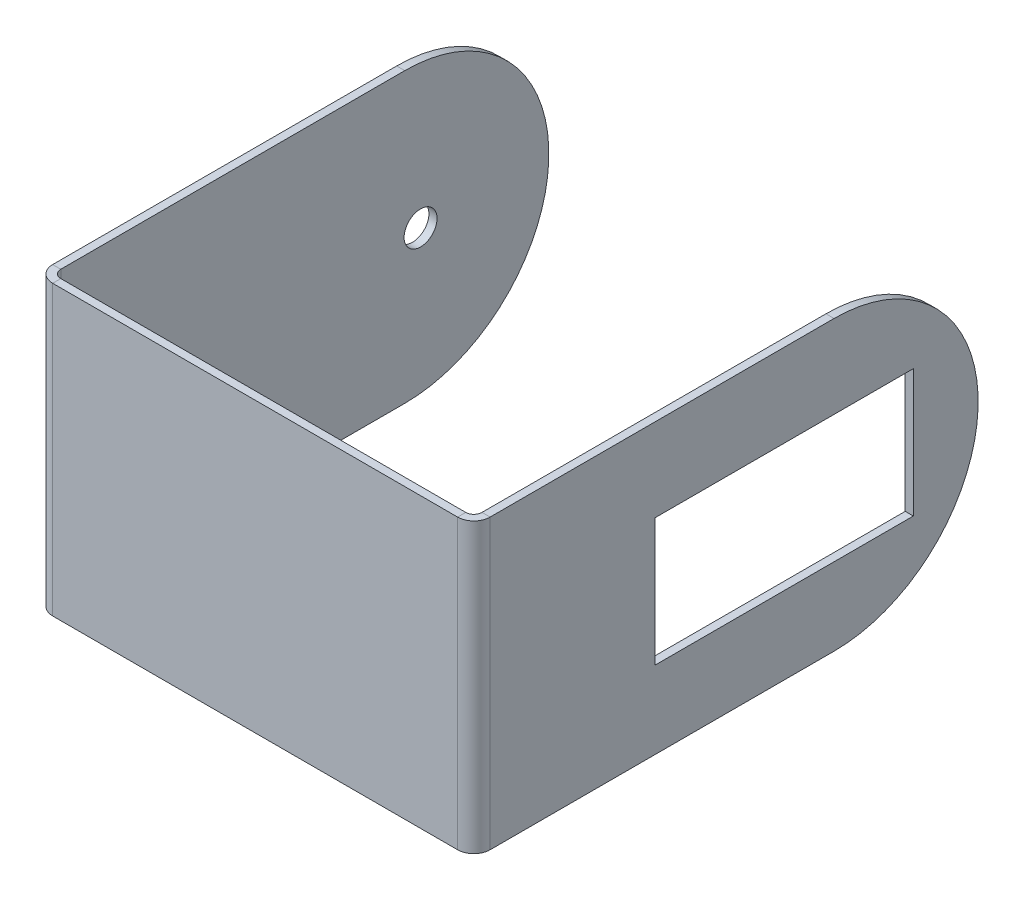
ISO-10303-21;
HEADER;
FILE_DESCRIPTION(('STEP AP214'),'2;1');
FILE_NAME('part.step','',(''),(''),'','','');
FILE_SCHEMA(('AUTOMOTIVE_DESIGN { 1 0 10303 214 1 1 1 1 }'));
ENDSEC;
DATA;
#1=APPLICATION_CONTEXT('core data for automotive mechanical design processes');
#2=APPLICATION_PROTOCOL_DEFINITION('international standard','automotive_design',2000,#1);
#3=PRODUCT_CONTEXT('',#1,'mechanical');
#4=PRODUCT('Part','Part','',(#3));
#5=PRODUCT_RELATED_PRODUCT_CATEGORY('part','',(#4));
#6=PRODUCT_DEFINITION_FORMATION('','',#4);
#7=PRODUCT_DEFINITION_CONTEXT('part definition',#1,'design');
#8=PRODUCT_DEFINITION('design','',#6,#7);
#9=PRODUCT_DEFINITION_SHAPE('','',#8);
#10=(LENGTH_UNIT() NAMED_UNIT(*) SI_UNIT(.MILLI.,.METRE.));
#11=(NAMED_UNIT(*) PLANE_ANGLE_UNIT() SI_UNIT($,.RADIAN.));
#12=(NAMED_UNIT(*) SI_UNIT($,.STERADIAN.) SOLID_ANGLE_UNIT());
#13=UNCERTAINTY_MEASURE_WITH_UNIT(LENGTH_MEASURE(1.E-05),#10,'distance_accuracy_value','');
#14=(GEOMETRIC_REPRESENTATION_CONTEXT(3) GLOBAL_UNCERTAINTY_ASSIGNED_CONTEXT((#13)) GLOBAL_UNIT_ASSIGNED_CONTEXT((#10,
#11,#12)) REPRESENTATION_CONTEXT('',''));
#15=CARTESIAN_POINT('',(0.,0.,0.));
#16=DIRECTION('',(0.,0.,1.));
#17=DIRECTION('',(1.,0.,0.));
#18=AXIS2_PLACEMENT_3D('',#15,#16,#17);
#19=CARTESIAN_POINT('',(62.7853260686794,40.884375444257,50.1276698219949));
#20=DIRECTION('',(0.,-1.,0.));
#21=DIRECTION('',(-1.,0.,0.));
#22=AXIS2_PLACEMENT_3D('',#19,#20,#21);
#23=PLANE('',#22);
#24=DIRECTION('',(0.,0.,1.));
#25=VECTOR('',#24,1.);
#26=CARTESIAN_POINT('',(60.1853259854794,40.884375444257,50.1276698219949));
#27=LINE('',#26,#25);
#28=CARTESIAN_POINT('',(60.1853259854794,40.884375444257,48.8276697803949));
#29=VERTEX_POINT('',#28);
#30=CARTESIAN_POINT('',(60.1853259854794,40.884375444257,50.1276698219949));
#31=VERTEX_POINT('',#30);
#32=EDGE_CURVE('E11',#29,#31,#27,.T.);
#33=ORIENTED_EDGE('',*,*,#32,.F.);
#34=DIRECTION('',(-1.,0.,0.));
#35=VECTOR('',#34,1.);
#36=CARTESIAN_POINT('',(62.7853260686794,40.884375444257,48.8276697803949));
#37=LINE('',#36,#35);
#38=CARTESIAN_POINT('',(-4.78217384812057,40.884375444257,48.8276697803949));
#39=VERTEX_POINT('',#38);
#40=EDGE_CURVE('E113',#29,#39,#37,.T.);
#41=ORIENTED_EDGE('',*,*,#40,.T.);
#42=DIRECTION('',(0.,0.,1.));
#43=VECTOR('',#42,1.);
#44=CARTESIAN_POINT('',(-4.78217384812057,40.884375444257,50.1276698219949));
#45=LINE('',#44,#43);
#46=CARTESIAN_POINT('',(-4.78217384812057,40.884375444257,50.1276698219949));
#47=VERTEX_POINT('',#46);
#48=EDGE_CURVE('E49',#39,#47,#45,.T.);
#49=ORIENTED_EDGE('',*,*,#48,.T.);
#50=DIRECTION('',(-1.,0.,0.));
#51=VECTOR('',#50,1.);
#52=CARTESIAN_POINT('',(62.7853260686794,40.884375444257,50.1276698219949));
#53=LINE('',#52,#51);
#54=EDGE_CURVE('E116',#31,#47,#53,.T.);
#55=ORIENTED_EDGE('',*,*,#54,.F.);
#56=EDGE_LOOP('',(#33,#41,#49,#55));
#57=FACE_BOUND('',#56,.T.);
#58=ADVANCED_FACE('F39',(#57),#23,.F.);
#59=CARTESIAN_POINT('',(-4.78217384812057,40.884375444257,47.5276697387949));
#60=DIRECTION('',(0.,1.,0.));
#61=DIRECTION('',(0.,0.,1.));
#62=AXIS2_PLACEMENT_3D('',#59,#60,#61);
#63=PLANE('',#62);
#64=ORIENTED_EDGE('',*,*,#48,.F.);
#65=CARTESIAN_POINT('',(-4.78217384812057,40.884375444257,47.5276697387949));
#66=DIRECTION('',(0.,-1.,0.));
#67=DIRECTION('',(0.,0.,-1.));
#68=AXIS2_PLACEMENT_3D('',#65,#66,#67);
#69=CIRCLE('',#68,1.3000000416);
#70=CARTESIAN_POINT('',(-6.08217388972057,40.884375444257,47.5276697387949));
#71=VERTEX_POINT('',#70);
#72=EDGE_CURVE('E152',#39,#71,#69,.T.);
#73=ORIENTED_EDGE('',*,*,#72,.T.);
#74=DIRECTION('',(-1.,0.,0.));
#75=VECTOR('',#74,1.);
#76=CARTESIAN_POINT('',(-7.38217393132057,40.884375444257,47.5276697387949));
#77=LINE('',#76,#75);
#78=CARTESIAN_POINT('',(-7.38217393132057,40.884375444257,47.5276697387949));
#79=VERTEX_POINT('',#78);
#80=EDGE_CURVE('E57',#71,#79,#77,.T.);
#81=ORIENTED_EDGE('',*,*,#80,.T.);
#82=CARTESIAN_POINT('',(-4.78217384812057,40.884375444257,47.5276697387949));
#83=DIRECTION('',(0.,-1.,0.));
#84=DIRECTION('',(0.,0.,-1.));
#85=AXIS2_PLACEMENT_3D('',#82,#83,#84);
#86=CIRCLE('',#85,2.6000000832);
#87=EDGE_CURVE('E208',#47,#79,#86,.T.);
#88=ORIENTED_EDGE('',*,*,#87,.F.);
#89=EDGE_LOOP('',(#64,#73,#81,#88));
#90=FACE_BOUND('',#89,.T.);
#91=ADVANCED_FACE('F209',(#90),#63,.T.);
#92=CARTESIAN_POINT('',(-7.38217393132057,40.884375444257,50.1276698219949));
#93=DIRECTION('',(0.,1.,0.));
#94=DIRECTION('',(0.,0.,1.));
#95=AXIS2_PLACEMENT_3D('',#92,#93,#94);
#96=PLANE('',#95);
#97=ORIENTED_EDGE('',*,*,#80,.F.);
#98=DIRECTION('',(0.,0.,-1.));
#99=VECTOR('',#98,1.);
#100=CARTESIAN_POINT('',(-6.08217388972057,40.884375444257,-7.65733017800509));
#101=LINE('',#100,#99);
#102=CARTESIAN_POINT('',(-6.08217388972057,40.884375444257,-7.65733017800509));
#103=VERTEX_POINT('',#102);
#104=EDGE_CURVE('E240',#103,#71,#101,.F.);
#105=ORIENTED_EDGE('',*,*,#104,.F.);
#106=DIRECTION('',(-1.,0.,0.));
#107=VECTOR('',#106,1.);
#108=CARTESIAN_POINT('',(-7.38217393132057,40.884375444257,-7.65733017800509));
#109=LINE('',#108,#107);
#110=CARTESIAN_POINT('',(-7.38217393132057,40.884375444257,-7.65733017800509));
#111=VERTEX_POINT('',#110);
#112=EDGE_CURVE('E192',#103,#111,#109,.T.);
#113=ORIENTED_EDGE('',*,*,#112,.T.);
#114=DIRECTION('',(0.,0.,1.));
#115=VECTOR('',#114,1.);
#116=CARTESIAN_POINT('',(-7.38217393132057,40.884375444257,50.1276698219949));
#117=LINE('',#116,#115);
#118=EDGE_CURVE('E278',#111,#79,#117,.T.);
#119=ORIENTED_EDGE('',*,*,#118,.T.);
#120=EDGE_LOOP('',(#97,#105,#113,#119));
#121=FACE_BOUND('',#120,.T.);
#122=ADVANCED_FACE('F275',(#121),#96,.T.);
#123=CARTESIAN_POINT('',(-7.38217393132057,17.770375444257,-7.65733017800509));
#124=DIRECTION('',(1.,0.,0.));
#125=DIRECTION('',(0.,0.,-1.));
#126=AXIS2_PLACEMENT_3D('',#123,#124,#125);
#127=CYLINDRICAL_SURFACE('',#126,23.114);
#128=ORIENTED_EDGE('',*,*,#112,.F.);
#129=CARTESIAN_POINT('',(-6.08217388972057,17.770375444257,-7.65733017800509));
#130=DIRECTION('',(1.,0.,0.));
#131=DIRECTION('',(0.,0.,-1.));
#132=AXIS2_PLACEMENT_3D('',#129,#130,#131);
#133=CIRCLE('',#132,23.114);
#134=CARTESIAN_POINT('',(-6.08217388972057,-5.34362455574294,-7.65733017800509));
#135=VERTEX_POINT('',#134);
#136=EDGE_CURVE('E158',#135,#103,#133,.T.);
#137=ORIENTED_EDGE('',*,*,#136,.F.);
#138=DIRECTION('',(-1.,0.,0.));
#139=VECTOR('',#138,1.);
#140=CARTESIAN_POINT('',(-7.38217393132057,-5.34362455574294,-7.65733017800509));
#141=LINE('',#140,#139);
#142=CARTESIAN_POINT('',(-7.38217393132057,-5.34362455574294,-7.65733017800509));
#143=VERTEX_POINT('',#142);
#144=EDGE_CURVE('E189',#135,#143,#141,.T.);
#145=ORIENTED_EDGE('',*,*,#144,.T.);
#146=CARTESIAN_POINT('',(-7.38217393132057,17.770375444257,-7.65733017800509));
#147=DIRECTION('',(1.,0.,0.));
#148=DIRECTION('',(0.,0.,-1.));
#149=AXIS2_PLACEMENT_3D('',#146,#147,#148);
#150=CIRCLE('',#149,23.114);
#151=EDGE_CURVE('E288',#143,#111,#150,.T.);
#152=ORIENTED_EDGE('',*,*,#151,.T.);
#153=EDGE_LOOP('',(#128,#137,#145,#152));
#154=FACE_BOUND('',#153,.T.);
#155=ADVANCED_FACE('F358',(#154),#127,.T.);
#156=CARTESIAN_POINT('',(-7.38217393132057,-5.34362455574294,-7.65733017800509));
#157=DIRECTION('',(0.,-1.,0.));
#158=DIRECTION('',(0.,0.,-1.));
#159=AXIS2_PLACEMENT_3D('',#156,#157,#158);
#160=PLANE('',#159);
#161=ORIENTED_EDGE('',*,*,#144,.F.);
#162=DIRECTION('',(0.,0.,-1.));
#163=VECTOR('',#162,1.);
#164=CARTESIAN_POINT('',(-6.08217388972057,-5.34362455574295,-7.65733017800509));
#165=LINE('',#164,#163);
#166=CARTESIAN_POINT('',(-6.08217388972057,-5.34362455574295,47.5276697387949));
#167=VERTEX_POINT('',#166);
#168=EDGE_CURVE('E259',#167,#135,#165,.T.);
#169=ORIENTED_EDGE('',*,*,#168,.F.);
#170=DIRECTION('',(-1.,0.,0.));
#171=VECTOR('',#170,1.);
#172=CARTESIAN_POINT('',(-7.38217393132057,-5.34362455574295,47.5276697387949));
#173=LINE('',#172,#171);
#174=CARTESIAN_POINT('',(-7.38217393132057,-5.34362455574295,47.5276697387949));
#175=VERTEX_POINT('',#174);
#176=EDGE_CURVE('E187',#167,#175,#173,.T.);
#177=ORIENTED_EDGE('',*,*,#176,.T.);
#178=DIRECTION('',(0.,0.,-1.));
#179=VECTOR('',#178,1.);
#180=CARTESIAN_POINT('',(-7.38217393132057,-5.34362455574294,-7.65733017800509));
#181=LINE('',#180,#179);
#182=EDGE_CURVE('E283',#175,#143,#181,.T.);
#183=ORIENTED_EDGE('',*,*,#182,.T.);
#184=EDGE_LOOP('',(#161,#169,#177,#183));
#185=FACE_BOUND('',#184,.T.);
#186=ADVANCED_FACE('F359',(#185),#160,.T.);
#187=CARTESIAN_POINT('',(-4.78217384812057,-5.34362455574295,47.5276697387949));
#188=DIRECTION('',(0.,1.,0.));
#189=DIRECTION('',(0.,0.,1.));
#190=AXIS2_PLACEMENT_3D('',#187,#188,#189);
#191=PLANE('',#190);
#192=ORIENTED_EDGE('',*,*,#176,.F.);
#193=CARTESIAN_POINT('',(-4.78217384812057,-5.34362455574295,47.5276697387949));
#194=DIRECTION('',(0.,-1.,0.));
#195=DIRECTION('',(0.,0.,-1.));
#196=AXIS2_PLACEMENT_3D('',#193,#194,#195);
#197=CIRCLE('',#196,1.3000000416);
#198=CARTESIAN_POINT('',(-4.78217384812057,-5.34362455574295,48.8276697803949));
#199=VERTEX_POINT('',#198);
#200=EDGE_CURVE('E256',#167,#199,#197,.F.);
#201=ORIENTED_EDGE('',*,*,#200,.T.);
#202=DIRECTION('',(0.,0.,1.));
#203=VECTOR('',#202,1.);
#204=CARTESIAN_POINT('',(-4.78217384812057,-5.34362455574295,50.1276698219949));
#205=LINE('',#204,#203);
#206=CARTESIAN_POINT('',(-4.78217384812057,-5.34362455574295,50.1276698219949));
#207=VERTEX_POINT('',#206);
#208=EDGE_CURVE('E184',#199,#207,#205,.T.);
#209=ORIENTED_EDGE('',*,*,#208,.T.);
#210=CARTESIAN_POINT('',(-4.78217384812057,-5.34362455574295,47.5276697387949));
#211=DIRECTION('',(0.,-1.,0.));
#212=DIRECTION('',(0.,0.,-1.));
#213=AXIS2_PLACEMENT_3D('',#210,#211,#212);
#214=CIRCLE('',#213,2.6000000832);
#215=EDGE_CURVE('E214',#175,#207,#214,.F.);
#216=ORIENTED_EDGE('',*,*,#215,.F.);
#217=EDGE_LOOP('',(#192,#201,#209,#216));
#218=FACE_BOUND('',#217,.T.);
#219=ADVANCED_FACE('F292',(#218),#191,.F.);
#220=CARTESIAN_POINT('',(62.7853260686794,-5.34362455574295,50.1276698219949));
#221=DIRECTION('',(0.,-1.,0.));
#222=DIRECTION('',(-1.,0.,0.));
#223=AXIS2_PLACEMENT_3D('',#220,#221,#222);
#224=PLANE('',#223);
#225=ORIENTED_EDGE('',*,*,#208,.F.);
#226=DIRECTION('',(-1.,0.,0.));
#227=VECTOR('',#226,1.);
#228=CARTESIAN_POINT('',(62.7853260686794,-5.34362455574295,48.8276697803949));
#229=LINE('',#228,#227);
#230=CARTESIAN_POINT('',(60.1853259854794,-5.34362455574295,48.8276697803949));
#231=VERTEX_POINT('',#230);
#232=EDGE_CURVE('E144',#231,#199,#229,.T.);
#233=ORIENTED_EDGE('',*,*,#232,.F.);
#234=DIRECTION('',(0.,0.,1.));
#235=VECTOR('',#234,1.);
#236=CARTESIAN_POINT('',(60.1853259854794,-5.34362455574295,50.1276698219949));
#237=LINE('',#236,#235);
#238=CARTESIAN_POINT('',(60.1853259854794,-5.34362455574295,50.1276698219949));
#239=VERTEX_POINT('',#238);
#240=EDGE_CURVE('E181',#231,#239,#237,.T.);
#241=ORIENTED_EDGE('',*,*,#240,.T.);
#242=DIRECTION('',(-1.,0.,0.));
#243=VECTOR('',#242,1.);
#244=CARTESIAN_POINT('',(62.7853260686794,-5.34362455574295,50.1276698219949));
#245=LINE('',#244,#243);
#246=EDGE_CURVE('E206',#239,#207,#245,.T.);
#247=ORIENTED_EDGE('',*,*,#246,.T.);
#248=EDGE_LOOP('',(#225,#233,#241,#247));
#249=FACE_BOUND('',#248,.T.);
#250=ADVANCED_FACE('F295',(#249),#224,.T.);
#251=CARTESIAN_POINT('',(60.1853259854794,-5.34362455574295,47.5276697387949));
#252=DIRECTION('',(0.,-1.,0.));
#253=DIRECTION('',(0.,0.,-1.));
#254=AXIS2_PLACEMENT_3D('',#251,#252,#253);
#255=PLANE('',#254);
#256=ORIENTED_EDGE('',*,*,#240,.F.);
#257=CARTESIAN_POINT('',(60.1853259854794,-5.34362455574295,47.5276697387949));
#258=DIRECTION('',(0.,1.,0.));
#259=DIRECTION('',(0.,0.,1.));
#260=AXIS2_PLACEMENT_3D('',#257,#258,#259);
#261=CIRCLE('',#260,1.3000000416);
#262=CARTESIAN_POINT('',(61.4853260270794,-5.34362455574295,47.5276697387949));
#263=VERTEX_POINT('',#262);
#264=EDGE_CURVE('E132',#231,#263,#261,.T.);
#265=ORIENTED_EDGE('',*,*,#264,.T.);
#266=DIRECTION('',(1.,0.,0.));
#267=VECTOR('',#266,1.);
#268=CARTESIAN_POINT('',(62.7853260686794,-5.34362455574295,47.5276697387949));
#269=LINE('',#268,#267);
#270=CARTESIAN_POINT('',(62.7853260686794,-5.34362455574295,47.5276697387949));
#271=VERTEX_POINT('',#270);
#272=EDGE_CURVE('E178',#263,#271,#269,.T.);
#273=ORIENTED_EDGE('',*,*,#272,.T.);
#274=CARTESIAN_POINT('',(60.1853259854794,-5.34362455574295,47.5276697387949));
#275=DIRECTION('',(0.,1.,0.));
#276=DIRECTION('',(0.,0.,1.));
#277=AXIS2_PLACEMENT_3D('',#274,#275,#276);
#278=CIRCLE('',#277,2.6000000832);
#279=EDGE_CURVE('E213',#239,#271,#278,.T.);
#280=ORIENTED_EDGE('',*,*,#279,.F.);
#281=EDGE_LOOP('',(#256,#265,#273,#280));
#282=FACE_BOUND('',#281,.T.);
#283=ADVANCED_FACE('F404',(#282),#255,.T.);
#284=CARTESIAN_POINT('',(62.7853260686794,-5.34362455574294,-7.65733017800509));
#285=DIRECTION('',(0.,-1.,0.));
#286=DIRECTION('',(0.,0.,-1.));
#287=AXIS2_PLACEMENT_3D('',#284,#285,#286);
#288=PLANE('',#287);
#289=ORIENTED_EDGE('',*,*,#272,.F.);
#290=DIRECTION('',(0.,0.,-1.));
#291=VECTOR('',#290,1.);
#292=CARTESIAN_POINT('',(61.4853260270794,-5.34362455574295,-7.65733017800509));
#293=LINE('',#292,#291);
#294=CARTESIAN_POINT('',(61.4853260270794,-5.34362455574294,-7.65733017800509));
#295=VERTEX_POINT('',#294);
#296=EDGE_CURVE('E231',#263,#295,#293,.T.);
#297=ORIENTED_EDGE('',*,*,#296,.T.);
#298=DIRECTION('',(1.,0.,0.));
#299=VECTOR('',#298,1.);
#300=CARTESIAN_POINT('',(62.7853260686794,-5.34362455574294,-7.65733017800509));
#301=LINE('',#300,#299);
#302=CARTESIAN_POINT('',(62.7853260686794,-5.34362455574294,-7.65733017800509));
#303=VERTEX_POINT('',#302);
#304=EDGE_CURVE('E175',#295,#303,#301,.T.);
#305=ORIENTED_EDGE('',*,*,#304,.T.);
#306=DIRECTION('',(0.,0.,-1.));
#307=VECTOR('',#306,1.);
#308=CARTESIAN_POINT('',(62.7853260686794,-5.34362455574294,-7.65733017800509));
#309=LINE('',#308,#307);
#310=EDGE_CURVE('E320',#271,#303,#309,.T.);
#311=ORIENTED_EDGE('',*,*,#310,.F.);
#312=EDGE_LOOP('',(#289,#297,#305,#311));
#313=FACE_BOUND('',#312,.T.);
#314=ADVANCED_FACE('F334',(#313),#288,.T.);
#315=CARTESIAN_POINT('',(62.7853260686794,17.770375444257,-7.65733017800509));
#316=DIRECTION('',(1.,0.,0.));
#317=DIRECTION('',(0.,0.,-1.));
#318=AXIS2_PLACEMENT_3D('',#315,#316,#317);
#319=CYLINDRICAL_SURFACE('',#318,23.114);
#320=ORIENTED_EDGE('',*,*,#304,.F.);
#321=CARTESIAN_POINT('',(61.4853260270794,17.770375444257,-7.65733017800509));
#322=DIRECTION('',(1.,0.,0.));
#323=DIRECTION('',(0.,0.,-1.));
#324=AXIS2_PLACEMENT_3D('',#321,#322,#323);
#325=CIRCLE('',#324,23.114);
#326=CARTESIAN_POINT('',(61.4853260270794,40.884375444257,-7.65733017800509));
#327=VERTEX_POINT('',#326);
#328=EDGE_CURVE('E244',#295,#327,#325,.T.);
#329=ORIENTED_EDGE('',*,*,#328,.T.);
#330=DIRECTION('',(1.,0.,0.));
#331=VECTOR('',#330,1.);
#332=CARTESIAN_POINT('',(62.7853260686794,40.884375444257,-7.65733017800509));
#333=LINE('',#332,#331);
#334=CARTESIAN_POINT('',(62.7853260686794,40.884375444257,-7.65733017800509));
#335=VERTEX_POINT('',#334);
#336=EDGE_CURVE('E172',#327,#335,#333,.T.);
#337=ORIENTED_EDGE('',*,*,#336,.T.);
#338=CARTESIAN_POINT('',(62.7853260686794,17.770375444257,-7.65733017800509));
#339=DIRECTION('',(1.,0.,0.));
#340=DIRECTION('',(0.,0.,-1.));
#341=AXIS2_PLACEMENT_3D('',#338,#339,#340);
#342=CIRCLE('',#341,23.114);
#343=EDGE_CURVE('E314',#303,#335,#342,.T.);
#344=ORIENTED_EDGE('',*,*,#343,.F.);
#345=EDGE_LOOP('',(#320,#329,#337,#344));
#346=FACE_BOUND('',#345,.T.);
#347=ADVANCED_FACE('F398',(#346),#319,.T.);
#348=CARTESIAN_POINT('',(62.7853260686794,40.884375444257,50.1276698219949));
#349=DIRECTION('',(0.,1.,0.));
#350=DIRECTION('',(0.,0.,1.));
#351=AXIS2_PLACEMENT_3D('',#348,#349,#350);
#352=PLANE('',#351);
#353=ORIENTED_EDGE('',*,*,#336,.F.);
#354=DIRECTION('',(0.,0.,-1.));
#355=VECTOR('',#354,1.);
#356=CARTESIAN_POINT('',(61.4853260270794,40.884375444257,-7.65733017800509));
#357=LINE('',#356,#355);
#358=CARTESIAN_POINT('',(61.4853260270794,40.884375444257,47.5276697387949));
#359=VERTEX_POINT('',#358);
#360=EDGE_CURVE('E250',#327,#359,#357,.F.);
#361=ORIENTED_EDGE('',*,*,#360,.T.);
#362=DIRECTION('',(1.,0.,0.));
#363=VECTOR('',#362,1.);
#364=CARTESIAN_POINT('',(62.7853260686794,40.884375444257,47.5276697387949));
#365=LINE('',#364,#363);
#366=CARTESIAN_POINT('',(62.7853260686794,40.884375444257,47.5276697387949));
#367=VERTEX_POINT('',#366);
#368=EDGE_CURVE('E43',#359,#367,#365,.T.);
#369=ORIENTED_EDGE('',*,*,#368,.T.);
#370=DIRECTION('',(0.,0.,1.));
#371=VECTOR('',#370,1.);
#372=CARTESIAN_POINT('',(62.7853260686794,40.884375444257,50.1276698219949));
#373=LINE('',#372,#371);
#374=EDGE_CURVE('E317',#335,#367,#373,.T.);
#375=ORIENTED_EDGE('',*,*,#374,.F.);
#376=EDGE_LOOP('',(#353,#361,#369,#375));
#377=FACE_BOUND('',#376,.T.);
#378=ADVANCED_FACE('F395',(#377),#352,.T.);
#379=CARTESIAN_POINT('',(62.7853260686794,27.554681885257,-20.3700301780051));
#380=DIRECTION('',(0.,0.,-1.));
#381=DIRECTION('',(0.,1.,0.));
#382=AXIS2_PLACEMENT_3D('',#379,#380,#381);
#383=PLANE('',#382);
#384=DIRECTION('',(1.,0.,0.));
#385=VECTOR('',#384,1.);
#386=CARTESIAN_POINT('',(62.7853260686794,27.554681885257,-20.3700301780051));
#387=LINE('',#386,#385);
#388=CARTESIAN_POINT('',(61.4853260270794,27.554681885257,-20.3700301780051));
#389=VERTEX_POINT('',#388);
#390=CARTESIAN_POINT('',(62.7853260686794,27.554681885257,-20.3700301780051));
#391=VERTEX_POINT('',#390);
#392=EDGE_CURVE('E166',#389,#391,#387,.T.);
#393=ORIENTED_EDGE('',*,*,#392,.F.);
#394=DIRECTION('',(0.,1.,0.));
#395=VECTOR('',#394,1.);
#396=CARTESIAN_POINT('',(61.4853260270794,17.770375444257,-20.3700301780051));
#397=LINE('',#396,#395);
#398=CARTESIAN_POINT('',(61.4853260270794,7.08228188525704,-20.3700301780051));
#399=VERTEX_POINT('',#398);
#400=EDGE_CURVE('E245',#399,#389,#397,.T.);
#401=ORIENTED_EDGE('',*,*,#400,.F.);
#402=DIRECTION('',(1.,0.,0.));
#403=VECTOR('',#402,1.);
#404=CARTESIAN_POINT('',(62.7853260686794,7.08228188525704,-20.3700301780051));
#405=LINE('',#404,#403);
#406=CARTESIAN_POINT('',(62.7853260686794,7.08228188525704,-20.3700301780051));
#407=VERTEX_POINT('',#406);
#408=EDGE_CURVE('E162',#399,#407,#405,.T.);
#409=ORIENTED_EDGE('',*,*,#408,.T.);
#410=DIRECTION('',(0.,1.,0.));
#411=VECTOR('',#410,1.);
#412=CARTESIAN_POINT('',(62.7853260686794,27.554681885257,-20.3700301780051));
#413=LINE('',#412,#411);
#414=EDGE_CURVE('E308',#407,#391,#413,.T.);
#415=ORIENTED_EDGE('',*,*,#414,.T.);
#416=EDGE_LOOP('',(#393,#401,#409,#415));
#417=FACE_BOUND('',#416,.T.);
#418=ADVANCED_FACE('F393',(#417),#383,.F.);
#419=CARTESIAN_POINT('',(62.7853260686794,7.08228188525704,-20.3700301780051));
#420=DIRECTION('',(0.,-1.,0.));
#421=DIRECTION('',(0.,0.,-1.));
#422=AXIS2_PLACEMENT_3D('',#419,#420,#421);
#423=PLANE('',#422);
#424=ORIENTED_EDGE('',*,*,#408,.F.);
#425=DIRECTION('',(0.,0.,-1.));
#426=VECTOR('',#425,1.);
#427=CARTESIAN_POINT('',(61.4853260270794,7.08228188525704,-7.65733017800509));
#428=LINE('',#427,#426);
#429=CARTESIAN_POINT('',(61.4853260270794,7.08228188525704,21.0700698219949));
#430=VERTEX_POINT('',#429);
#431=EDGE_CURVE('E241',#430,#399,#428,.T.);
#432=ORIENTED_EDGE('',*,*,#431,.F.);
#433=DIRECTION('',(1.,0.,0.));
#434=VECTOR('',#433,1.);
#435=CARTESIAN_POINT('',(62.7853260686794,7.08228188525704,21.0700698219949));
#436=LINE('',#435,#434);
#437=CARTESIAN_POINT('',(62.7853260686794,7.08228188525704,21.0700698219949));
#438=VERTEX_POINT('',#437);
#439=EDGE_CURVE('E159',#430,#438,#436,.T.);
#440=ORIENTED_EDGE('',*,*,#439,.T.);
#441=DIRECTION('',(0.,0.,-1.));
#442=VECTOR('',#441,1.);
#443=CARTESIAN_POINT('',(62.7853260686794,7.08228188525704,-20.3700301780051));
#444=LINE('',#443,#442);
#445=EDGE_CURVE('E311',#438,#407,#444,.T.);
#446=ORIENTED_EDGE('',*,*,#445,.T.);
#447=EDGE_LOOP('',(#424,#432,#440,#446));
#448=FACE_BOUND('',#447,.T.);
#449=ADVANCED_FACE('F434',(#448),#423,.F.);
#450=CARTESIAN_POINT('',(62.7853260686794,7.08228188525704,21.0700698219949));
#451=DIRECTION('',(0.,0.,1.));
#452=DIRECTION('',(0.,-1.,0.));
#453=AXIS2_PLACEMENT_3D('',#450,#451,#452);
#454=PLANE('',#453);
#455=ORIENTED_EDGE('',*,*,#439,.F.);
#456=DIRECTION('',(0.,1.,0.));
#457=VECTOR('',#456,1.);
#458=CARTESIAN_POINT('',(61.4853260270794,17.770375444257,21.0700698219949));
#459=LINE('',#458,#457);
#460=CARTESIAN_POINT('',(61.4853260270794,27.554681885257,21.0700698219949));
#461=VERTEX_POINT('',#460);
#462=EDGE_CURVE('E236',#461,#430,#459,.F.);
#463=ORIENTED_EDGE('',*,*,#462,.F.);
#464=DIRECTION('',(1.,0.,0.));
#465=VECTOR('',#464,1.);
#466=CARTESIAN_POINT('',(62.7853260686794,27.554681885257,21.0700698219949));
#467=LINE('',#466,#465);
#468=CARTESIAN_POINT('',(62.7853260686794,27.554681885257,21.0700698219949));
#469=VERTEX_POINT('',#468);
#470=EDGE_CURVE('E163',#461,#469,#467,.T.);
#471=ORIENTED_EDGE('',*,*,#470,.T.);
#472=DIRECTION('',(0.,-1.,0.));
#473=VECTOR('',#472,1.);
#474=CARTESIAN_POINT('',(62.7853260686794,7.08228188525704,21.0700698219949));
#475=LINE('',#474,#473);
#476=EDGE_CURVE('E282',#469,#438,#475,.T.);
#477=ORIENTED_EDGE('',*,*,#476,.T.);
#478=EDGE_LOOP('',(#455,#463,#471,#477));
#479=FACE_BOUND('',#478,.T.);
#480=ADVANCED_FACE('F388',(#479),#454,.F.);
#481=CARTESIAN_POINT('',(-7.38217393132057,17.7617307913325,-10.1909512315668));
#482=DIRECTION('',(1.,0.,0.));
#483=DIRECTION('',(0.,0.,-1.));
#484=AXIS2_PLACEMENT_3D('',#481,#482,#483);
#485=CYLINDRICAL_SURFACE('',#484,2.6416);
#486=CARTESIAN_POINT('',(-7.38217393132057,17.7617307913325,-10.1909512315668));
#487=DIRECTION('',(-1.,0.,0.));
#488=DIRECTION('',(0.,0.,1.));
#489=AXIS2_PLACEMENT_3D('',#486,#487,#488);
#490=CIRCLE('',#489,2.6416);
#491=CARTESIAN_POINT('',(-7.38217393132057,17.7617307913325,-7.5493512315668));
#492=VERTEX_POINT('',#491);
#493=EDGE_CURVE('E205',#492,#492,#490,.T.);
#494=ORIENTED_EDGE('',*,*,#493,.T.);
#495=EDGE_LOOP('',(#494));
#496=FACE_BOUND('',#495,.T.);
#497=CARTESIAN_POINT('',(-6.08217388972057,17.7617307913325,-10.1909512315668));
#498=DIRECTION('',(-1.,0.,0.));
#499=DIRECTION('',(0.,0.,1.));
#500=AXIS2_PLACEMENT_3D('',#497,#498,#499);
#501=CIRCLE('',#500,2.6416);
#502=CARTESIAN_POINT('',(-6.08217388972057,17.7617307913325,-7.5493512315668));
#503=VERTEX_POINT('',#502);
#504=EDGE_CURVE('E143',#503,#503,#501,.T.);
#505=ORIENTED_EDGE('',*,*,#504,.F.);
#506=EDGE_LOOP('',(#505));
#507=FACE_BOUND('',#506,.T.);
#508=ADVANCED_FACE('F41',(#496,#507),#485,.F.);
#509=CARTESIAN_POINT('',(62.7853260686794,27.554681885257,21.0700698219949));
#510=DIRECTION('',(0.,1.,0.));
#511=DIRECTION('',(0.,0.,1.));
#512=AXIS2_PLACEMENT_3D('',#509,#510,#511);
#513=PLANE('',#512);
#514=DIRECTION('',(0.,0.,-1.));
#515=VECTOR('',#514,1.);
#516=CARTESIAN_POINT('',(61.4853260270794,27.554681885257,-7.65733017800509));
#517=LINE('',#516,#515);
#518=EDGE_CURVE('E239',#389,#461,#517,.F.);
#519=ORIENTED_EDGE('',*,*,#518,.F.);
#520=ORIENTED_EDGE('',*,*,#392,.T.);
#521=DIRECTION('',(0.,0.,1.));
#522=VECTOR('',#521,1.);
#523=CARTESIAN_POINT('',(62.7853260686794,27.554681885257,21.0700698219949));
#524=LINE('',#523,#522);
#525=EDGE_CURVE('E305',#391,#469,#524,.T.);
#526=ORIENTED_EDGE('',*,*,#525,.T.);
#527=ORIENTED_EDGE('',*,*,#470,.F.);
#528=EDGE_LOOP('',(#519,#520,#526,#527));
#529=FACE_BOUND('',#528,.T.);
#530=ADVANCED_FACE('F376',(#529),#513,.F.);
#531=CARTESIAN_POINT('',(60.1853259854794,40.884375444257,47.5276697387949));
#532=DIRECTION('',(0.,-1.,0.));
#533=DIRECTION('',(0.,0.,-1.));
#534=AXIS2_PLACEMENT_3D('',#531,#532,#533);
#535=PLANE('',#534);
#536=CARTESIAN_POINT('',(60.1853259854794,40.884375444257,47.5276697387949));
#537=DIRECTION('',(0.,1.,0.));
#538=DIRECTION('',(0.,0.,1.));
#539=AXIS2_PLACEMENT_3D('',#536,#537,#538);
#540=CIRCLE('',#539,1.3000000416);
#541=EDGE_CURVE('E129',#359,#29,#540,.F.);
#542=ORIENTED_EDGE('',*,*,#541,.T.);
#543=ORIENTED_EDGE('',*,*,#32,.T.);
#544=CARTESIAN_POINT('',(60.1853259854794,40.884375444257,47.5276697387949));
#545=DIRECTION('',(0.,1.,0.));
#546=DIRECTION('',(0.,0.,1.));
#547=AXIS2_PLACEMENT_3D('',#544,#545,#546);
#548=CIRCLE('',#547,2.6000000832);
#549=EDGE_CURVE('E226',#367,#31,#548,.F.);
#550=ORIENTED_EDGE('',*,*,#549,.F.);
#551=ORIENTED_EDGE('',*,*,#368,.F.);
#552=EDGE_LOOP('',(#542,#543,#550,#551));
#553=FACE_BOUND('',#552,.T.);
#554=ADVANCED_FACE('F147',(#553),#535,.F.);
#555=CARTESIAN_POINT('',(62.7853260686794,17.770375444257,-7.65733017800509));
#556=DIRECTION('',(1.,0.,0.));
#557=DIRECTION('',(0.,0.,-1.));
#558=AXIS2_PLACEMENT_3D('',#555,#556,#557);
#559=PLANE('',#558);
#560=ORIENTED_EDGE('',*,*,#476,.F.);
#561=ORIENTED_EDGE('',*,*,#525,.F.);
#562=ORIENTED_EDGE('',*,*,#414,.F.);
#563=ORIENTED_EDGE('',*,*,#445,.F.);
#564=EDGE_LOOP('',(#560,#561,#562,#563));
#565=FACE_BOUND('',#564,.T.);
#566=ORIENTED_EDGE('',*,*,#374,.T.);
#567=DIRECTION('',(0.,-1.,0.));
#568=VECTOR('',#567,1.);
#569=CARTESIAN_POINT('',(62.7853260686794,-5.34362455574295,47.5276697387949));
#570=LINE('',#569,#568);
#571=EDGE_CURVE('E223',#367,#271,#570,.T.);
#572=ORIENTED_EDGE('',*,*,#571,.T.);
#573=ORIENTED_EDGE('',*,*,#310,.T.);
#574=ORIENTED_EDGE('',*,*,#343,.T.);
#575=EDGE_LOOP('',(#566,#572,#573,#574));
#576=FACE_BOUND('',#575,.T.);
#577=ADVANCED_FACE('F338',(#565,#576),#559,.T.);
#578=CARTESIAN_POINT('',(-7.38217393132057,17.770375444257,-7.65733017800509));
#579=DIRECTION('',(1.,0.,0.));
#580=DIRECTION('',(0.,0.,-1.));
#581=AXIS2_PLACEMENT_3D('',#578,#579,#580);
#582=PLANE('',#581);
#583=ORIENTED_EDGE('',*,*,#493,.F.);
#584=EDGE_LOOP('',(#583));
#585=FACE_BOUND('',#584,.T.);
#586=ORIENTED_EDGE('',*,*,#182,.F.);
#587=DIRECTION('',(0.,-1.,0.));
#588=VECTOR('',#587,1.);
#589=CARTESIAN_POINT('',(-7.38217393132057,17.770375444257,47.5276697387949));
#590=LINE('',#589,#588);
#591=EDGE_CURVE('E171',#175,#79,#590,.F.);
#592=ORIENTED_EDGE('',*,*,#591,.T.);
#593=ORIENTED_EDGE('',*,*,#118,.F.);
#594=ORIENTED_EDGE('',*,*,#151,.F.);
#595=EDGE_LOOP('',(#586,#592,#593,#594));
#596=FACE_BOUND('',#595,.T.);
#597=ADVANCED_FACE('F286',(#585,#596),#582,.F.);
#598=CARTESIAN_POINT('',(62.7853260686794,-5.34362455574295,50.1276698219949));
#599=DIRECTION('',(0.,0.,-1.));
#600=DIRECTION('',(-1.,0.,0.));
#601=AXIS2_PLACEMENT_3D('',#598,#599,#600);
#602=PLANE('',#601);
#603=ORIENTED_EDGE('',*,*,#54,.T.);
#604=DIRECTION('',(0.,-1.,0.));
#605=VECTOR('',#604,1.);
#606=CARTESIAN_POINT('',(-4.78217384812057,-5.34362455574295,50.1276698219949));
#607=LINE('',#606,#605);
#608=EDGE_CURVE('E202',#47,#207,#607,.T.);
#609=ORIENTED_EDGE('',*,*,#608,.T.);
#610=ORIENTED_EDGE('',*,*,#246,.F.);
#611=DIRECTION('',(0.,-1.,0.));
#612=VECTOR('',#611,1.);
#613=CARTESIAN_POINT('',(60.1853259854794,40.884375444257,50.1276698219949));
#614=LINE('',#613,#612);
#615=EDGE_CURVE('E204',#239,#31,#614,.F.);
#616=ORIENTED_EDGE('',*,*,#615,.T.);
#617=EDGE_LOOP('',(#603,#609,#610,#616));
#618=FACE_BOUND('',#617,.T.);
#619=ADVANCED_FACE('F199',(#618),#602,.F.);
#620=CARTESIAN_POINT('',(60.1853259854794,17.770375444257,47.5276697387949));
#621=DIRECTION('',(0.,1.,0.));
#622=DIRECTION('',(0.,0.,1.));
#623=AXIS2_PLACEMENT_3D('',#620,#621,#622);
#624=CYLINDRICAL_SURFACE('',#623,2.6000000832);
#625=ORIENTED_EDGE('',*,*,#549,.T.);
#626=ORIENTED_EDGE('',*,*,#615,.F.);
#627=ORIENTED_EDGE('',*,*,#279,.T.);
#628=ORIENTED_EDGE('',*,*,#571,.F.);
#629=EDGE_LOOP('',(#625,#626,#627,#628));
#630=FACE_BOUND('',#629,.T.);
#631=ADVANCED_FACE('F329',(#630),#624,.T.);
#632=CARTESIAN_POINT('',(-4.78217384812057,-5.34362455574295,47.5276697387949));
#633=DIRECTION('',(0.,-1.,0.));
#634=DIRECTION('',(0.,0.,-1.));
#635=AXIS2_PLACEMENT_3D('',#632,#633,#634);
#636=CYLINDRICAL_SURFACE('',#635,2.6000000832);
#637=ORIENTED_EDGE('',*,*,#87,.T.);
#638=ORIENTED_EDGE('',*,*,#591,.F.);
#639=ORIENTED_EDGE('',*,*,#215,.T.);
#640=ORIENTED_EDGE('',*,*,#608,.F.);
#641=EDGE_LOOP('',(#637,#638,#639,#640));
#642=FACE_BOUND('',#641,.T.);
#643=ADVANCED_FACE('F217',(#642),#636,.T.);
#644=CARTESIAN_POINT('',(61.4853260270794,17.770375444257,-7.65733017800509));
#645=DIRECTION('',(1.,0.,0.));
#646=DIRECTION('',(0.,0.,-1.));
#647=AXIS2_PLACEMENT_3D('',#644,#645,#646);
#648=PLANE('',#647);
#649=ORIENTED_EDGE('',*,*,#462,.T.);
#650=ORIENTED_EDGE('',*,*,#431,.T.);
#651=ORIENTED_EDGE('',*,*,#400,.T.);
#652=ORIENTED_EDGE('',*,*,#518,.T.);
#653=EDGE_LOOP('',(#649,#650,#651,#652));
#654=FACE_BOUND('',#653,.T.);
#655=ORIENTED_EDGE('',*,*,#360,.F.);
#656=ORIENTED_EDGE('',*,*,#328,.F.);
#657=ORIENTED_EDGE('',*,*,#296,.F.);
#658=DIRECTION('',(0.,1.,0.));
#659=VECTOR('',#658,1.);
#660=CARTESIAN_POINT('',(61.4853260270794,17.770375444257,47.5276697387949));
#661=LINE('',#660,#659);
#662=EDGE_CURVE('E137',#359,#263,#661,.F.);
#663=ORIENTED_EDGE('',*,*,#662,.F.);
#664=EDGE_LOOP('',(#655,#656,#657,#663));
#665=FACE_BOUND('',#664,.T.);
#666=ADVANCED_FACE('F507',(#654,#665),#648,.F.);
#667=CARTESIAN_POINT('',(-6.08217388972057,17.770375444257,-7.65733017800509));
#668=DIRECTION('',(1.,0.,0.));
#669=DIRECTION('',(0.,0.,-1.));
#670=AXIS2_PLACEMENT_3D('',#667,#668,#669);
#671=PLANE('',#670);
#672=ORIENTED_EDGE('',*,*,#504,.T.);
#673=EDGE_LOOP('',(#672));
#674=FACE_BOUND('',#673,.T.);
#675=ORIENTED_EDGE('',*,*,#168,.T.);
#676=ORIENTED_EDGE('',*,*,#136,.T.);
#677=ORIENTED_EDGE('',*,*,#104,.T.);
#678=DIRECTION('',(0.,1.,0.));
#679=VECTOR('',#678,1.);
#680=CARTESIAN_POINT('',(-6.08217388972057,17.770375444257,47.5276697387949));
#681=LINE('',#680,#679);
#682=EDGE_CURVE('E229',#167,#71,#681,.T.);
#683=ORIENTED_EDGE('',*,*,#682,.F.);
#684=EDGE_LOOP('',(#675,#676,#677,#683));
#685=FACE_BOUND('',#684,.T.);
#686=ADVANCED_FACE('F272',(#674,#685),#671,.T.);
#687=CARTESIAN_POINT('',(62.7853260686794,-5.34362455574295,48.8276697803949));
#688=DIRECTION('',(0.,0.,-1.));
#689=DIRECTION('',(-1.,0.,0.));
#690=AXIS2_PLACEMENT_3D('',#687,#688,#689);
#691=PLANE('',#690);
#692=ORIENTED_EDGE('',*,*,#40,.F.);
#693=DIRECTION('',(0.,1.,0.));
#694=VECTOR('',#693,1.);
#695=CARTESIAN_POINT('',(60.1853259854794,-5.34362455574295,48.8276697803949));
#696=LINE('',#695,#694);
#697=EDGE_CURVE('E126',#231,#29,#696,.T.);
#698=ORIENTED_EDGE('',*,*,#697,.F.);
#699=ORIENTED_EDGE('',*,*,#232,.T.);
#700=DIRECTION('',(0.,1.,0.));
#701=VECTOR('',#700,1.);
#702=CARTESIAN_POINT('',(-4.78217384812057,-5.34362455574295,48.8276697803949));
#703=LINE('',#702,#701);
#704=EDGE_CURVE('E136',#39,#199,#703,.F.);
#705=ORIENTED_EDGE('',*,*,#704,.F.);
#706=EDGE_LOOP('',(#692,#698,#699,#705));
#707=FACE_BOUND('',#706,.T.);
#708=ADVANCED_FACE('F140',(#707),#691,.T.);
#709=CARTESIAN_POINT('',(60.1853259854794,17.770375444257,47.5276697387949));
#710=DIRECTION('',(0.,1.,0.));
#711=DIRECTION('',(0.,0.,1.));
#712=AXIS2_PLACEMENT_3D('',#709,#710,#711);
#713=CYLINDRICAL_SURFACE('',#712,1.3000000416);
#714=ORIENTED_EDGE('',*,*,#541,.F.);
#715=ORIENTED_EDGE('',*,*,#662,.T.);
#716=ORIENTED_EDGE('',*,*,#264,.F.);
#717=ORIENTED_EDGE('',*,*,#697,.T.);
#718=EDGE_LOOP('',(#714,#715,#716,#717));
#719=FACE_BOUND('',#718,.T.);
#720=ADVANCED_FACE('F127',(#719),#713,.F.);
#721=CARTESIAN_POINT('',(-4.78217384812057,-5.34362455574295,47.5276697387949));
#722=DIRECTION('',(0.,-1.,0.));
#723=DIRECTION('',(0.,0.,-1.));
#724=AXIS2_PLACEMENT_3D('',#721,#722,#723);
#725=CYLINDRICAL_SURFACE('',#724,1.3000000416);
#726=ORIENTED_EDGE('',*,*,#72,.F.);
#727=ORIENTED_EDGE('',*,*,#704,.T.);
#728=ORIENTED_EDGE('',*,*,#200,.F.);
#729=ORIENTED_EDGE('',*,*,#682,.T.);
#730=EDGE_LOOP('',(#726,#727,#728,#729));
#731=FACE_BOUND('',#730,.T.);
#732=ADVANCED_FACE('F266',(#731),#725,.F.);
#733=CLOSED_SHELL('',(#58,#91,#122,#155,#186,#219,#250,#283,#314,#347,#378,#418,#449,#480,#508,
#530,#554,#577,#597,#619,#631,#643,#666,#686,#708,#720,#732));
#734=MANIFOLD_SOLID_BREP('B2',#733);
#735=ADVANCED_BREP_SHAPE_REPRESENTATION('',(#18,#734),#14);
#736=SHAPE_DEFINITION_REPRESENTATION(#9,#735);
ENDSEC;
END-ISO-10303-21;
